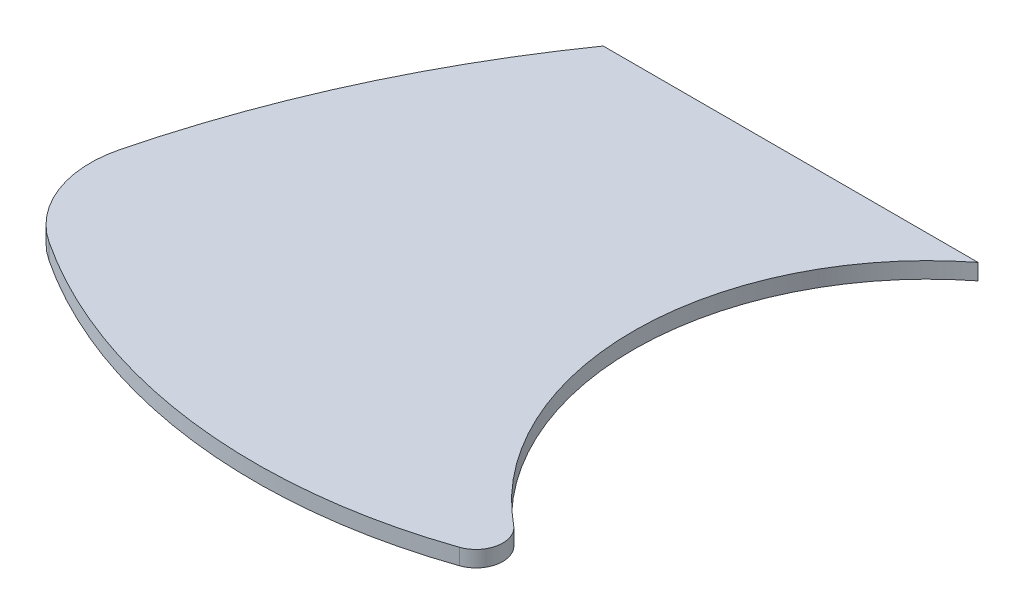
ISO-10303-21;
HEADER;
FILE_DESCRIPTION(('STEP AP214'),'2;1');
FILE_NAME('part.step','',(''),(''),'','','');
FILE_SCHEMA(('AUTOMOTIVE_DESIGN { 1 0 10303 214 1 1 1 1 }'));
ENDSEC;
DATA;
#1=APPLICATION_CONTEXT('core data for automotive mechanical design processes');
#2=APPLICATION_PROTOCOL_DEFINITION('international standard','automotive_design',2000,#1);
#3=PRODUCT_CONTEXT('',#1,'mechanical');
#4=PRODUCT('Part','Part','',(#3));
#5=PRODUCT_RELATED_PRODUCT_CATEGORY('part','',(#4));
#6=PRODUCT_DEFINITION_FORMATION('','',#4);
#7=PRODUCT_DEFINITION_CONTEXT('part definition',#1,'design');
#8=PRODUCT_DEFINITION('design','',#6,#7);
#9=PRODUCT_DEFINITION_SHAPE('','',#8);
#10=(LENGTH_UNIT() NAMED_UNIT(*) SI_UNIT(.MILLI.,.METRE.));
#11=(NAMED_UNIT(*) PLANE_ANGLE_UNIT() SI_UNIT($,.RADIAN.));
#12=(NAMED_UNIT(*) SI_UNIT($,.STERADIAN.) SOLID_ANGLE_UNIT());
#13=UNCERTAINTY_MEASURE_WITH_UNIT(LENGTH_MEASURE(1.E-05),#10,'distance_accuracy_value','');
#14=(GEOMETRIC_REPRESENTATION_CONTEXT(3) GLOBAL_UNCERTAINTY_ASSIGNED_CONTEXT((#13)) GLOBAL_UNIT_ASSIGNED_CONTEXT((#10,
#11,#12)) REPRESENTATION_CONTEXT('',''));
#15=CARTESIAN_POINT('',(0.,0.,0.));
#16=DIRECTION('',(0.,0.,1.));
#17=DIRECTION('',(1.,0.,0.));
#18=AXIS2_PLACEMENT_3D('',#15,#16,#17);
#19=CARTESIAN_POINT('',(33.9302660176223,3.,43.2866844188069));
#20=DIRECTION('',(0.,-1.,0.));
#21=DIRECTION('',(0.,0.,-1.));
#22=AXIS2_PLACEMENT_3D('',#19,#20,#21);
#23=CYLINDRICAL_SURFACE('',#22,55.);
#24=CARTESIAN_POINT('',(33.9302660176223,0.,43.2866844188069));
#25=DIRECTION('',(0.,-1.,0.));
#26=DIRECTION('',(0.,0.,1.));
#27=AXIS2_PLACEMENT_3D('',#24,#25,#26);
#28=CIRCLE('',#27,55.);
#29=CARTESIAN_POINT('',(-0.820695536764456,0.,85.9173150855649));
#30=VERTEX_POINT('',#29);
#31=CARTESIAN_POINT('',(0.,0.,0.));
#32=VERTEX_POINT('',#31);
#33=EDGE_CURVE('E123',#30,#32,#28,.T.);
#34=ORIENTED_EDGE('',*,*,#33,.T.);
#35=DIRECTION('',(0.,-1.,0.));
#36=VECTOR('',#35,1.);
#37=CARTESIAN_POINT('',(0.,3.,0.));
#38=LINE('',#37,#36);
#39=CARTESIAN_POINT('',(0.,3.,0.));
#40=VERTEX_POINT('',#39);
#41=EDGE_CURVE('E11',#40,#32,#38,.T.);
#42=ORIENTED_EDGE('',*,*,#41,.F.);
#43=CARTESIAN_POINT('',(33.9302660176223,3.,43.2866844188069));
#44=DIRECTION('',(0.,-1.,0.));
#45=DIRECTION('',(0.,0.,1.));
#46=AXIS2_PLACEMENT_3D('',#43,#44,#45);
#47=CIRCLE('',#46,55.);
#48=CARTESIAN_POINT('',(-0.820695536764456,3.,85.9173150855649));
#49=VERTEX_POINT('',#48);
#50=EDGE_CURVE('E133',#49,#40,#47,.T.);
#51=ORIENTED_EDGE('',*,*,#50,.F.);
#52=DIRECTION('',(0.,-1.,0.));
#53=VECTOR('',#52,1.);
#54=CARTESIAN_POINT('',(-0.820695536764456,3.,85.9173150855649));
#55=LINE('',#54,#53);
#56=EDGE_CURVE('E119',#49,#30,#55,.T.);
#57=ORIENTED_EDGE('',*,*,#56,.T.);
#58=EDGE_LOOP('',(#34,#42,#51,#57));
#59=FACE_BOUND('',#58,.T.);
#60=ADVANCED_FACE('F39',(#59),#23,.F.);
#61=CARTESIAN_POINT('',(0.,3.,0.));
#62=DIRECTION('',(0.,0.,1.));
#63=DIRECTION('',(1.,0.,0.));
#64=AXIS2_PLACEMENT_3D('',#61,#62,#63);
#65=PLANE('',#64);
#66=DIRECTION('',(-1.,0.,0.));
#67=VECTOR('',#66,1.);
#68=CARTESIAN_POINT('',(0.,0.,0.));
#69=LINE('',#68,#67);
#70=CARTESIAN_POINT('',(-70.,0.,0.));
#71=VERTEX_POINT('',#70);
#72=EDGE_CURVE('E126',#32,#71,#69,.T.);
#73=ORIENTED_EDGE('',*,*,#72,.T.);
#74=DIRECTION('',(0.,-1.,0.));
#75=VECTOR('',#74,1.);
#76=CARTESIAN_POINT('',(-70.,3.,0.));
#77=LINE('',#76,#75);
#78=CARTESIAN_POINT('',(-70.,3.,0.));
#79=VERTEX_POINT('',#78);
#80=EDGE_CURVE('E47',#79,#71,#77,.T.);
#81=ORIENTED_EDGE('',*,*,#80,.F.);
#82=DIRECTION('',(-1.,0.,0.));
#83=VECTOR('',#82,1.);
#84=CARTESIAN_POINT('',(0.,3.,0.));
#85=LINE('',#84,#83);
#86=EDGE_CURVE('E92',#40,#79,#85,.T.);
#87=ORIENTED_EDGE('',*,*,#86,.F.);
#88=ORIENTED_EDGE('',*,*,#41,.T.);
#89=EDGE_LOOP('',(#73,#81,#87,#88));
#90=FACE_BOUND('',#89,.T.);
#91=ADVANCED_FACE('F157',(#90),#65,.F.);
#92=CARTESIAN_POINT('',(84.1791212349216,3.,108.175879746189));
#93=DIRECTION('',(0.,-1.,0.));
#94=DIRECTION('',(0.,0.,-1.));
#95=AXIS2_PLACEMENT_3D('',#92,#93,#94);
#96=CYLINDRICAL_SURFACE('',#95,188.343362993323);
#97=CARTESIAN_POINT('',(84.1791212349216,0.,108.175879746189));
#98=DIRECTION('',(0.,1.,0.));
#99=DIRECTION('',(0.,0.,1.));
#100=AXIS2_PLACEMENT_3D('',#97,#98,#99);
#101=CIRCLE('',#100,188.343362993323);
#102=CARTESIAN_POINT('',(-98.3899552973508,0.,61.8967842733099));
#103=VERTEX_POINT('',#102);
#104=EDGE_CURVE('E128',#71,#103,#101,.T.);
#105=ORIENTED_EDGE('',*,*,#104,.T.);
#106=DIRECTION('',(0.,-1.,0.));
#107=VECTOR('',#106,1.);
#108=CARTESIAN_POINT('',(-98.3899552973508,3.,61.8967842733099));
#109=LINE('',#108,#107);
#110=CARTESIAN_POINT('',(-98.3899552973508,3.,61.8967842733099));
#111=VERTEX_POINT('',#110);
#112=EDGE_CURVE('E114',#111,#103,#109,.T.);
#113=ORIENTED_EDGE('',*,*,#112,.F.);
#114=CARTESIAN_POINT('',(84.1791212349216,3.,108.175879746189));
#115=DIRECTION('',(0.,1.,0.));
#116=DIRECTION('',(0.,0.,1.));
#117=AXIS2_PLACEMENT_3D('',#114,#115,#116);
#118=CIRCLE('',#117,188.343362993323);
#119=EDGE_CURVE('E105',#79,#111,#118,.T.);
#120=ORIENTED_EDGE('',*,*,#119,.F.);
#121=ORIENTED_EDGE('',*,*,#80,.T.);
#122=EDGE_LOOP('',(#105,#113,#120,#121));
#123=FACE_BOUND('',#122,.T.);
#124=ADVANCED_FACE('F139',(#123),#96,.T.);
#125=CARTESIAN_POINT('',(-79.003121205539,3.,66.8111167708687));
#126=DIRECTION('',(0.,-1.,0.));
#127=DIRECTION('',(0.,0.,-1.));
#128=AXIS2_PLACEMENT_3D('',#125,#126,#127);
#129=CYLINDRICAL_SURFACE('',#128,20.);
#130=CARTESIAN_POINT('',(-79.003121205539,0.,66.8111167708687));
#131=DIRECTION('',(0.,1.,0.));
#132=DIRECTION('',(0.,0.,1.));
#133=AXIS2_PLACEMENT_3D('',#130,#131,#132);
#134=CIRCLE('',#133,20.);
#135=CARTESIAN_POINT('',(-90.0039015069237,0.,83.5138959635858));
#136=VERTEX_POINT('',#135);
#137=EDGE_CURVE('E113',#103,#136,#134,.T.);
#138=ORIENTED_EDGE('',*,*,#137,.T.);
#139=DIRECTION('',(0.,-1.,0.));
#140=VECTOR('',#139,1.);
#141=CARTESIAN_POINT('',(-90.0039015069237,3.,83.5138959635858));
#142=LINE('',#141,#140);
#143=CARTESIAN_POINT('',(-90.0039015069237,3.,83.5138959635858));
#144=VERTEX_POINT('',#143);
#145=EDGE_CURVE('E110',#144,#136,#142,.T.);
#146=ORIENTED_EDGE('',*,*,#145,.F.);
#147=CARTESIAN_POINT('',(-79.003121205539,3.,66.8111167708687));
#148=DIRECTION('',(0.,1.,0.));
#149=DIRECTION('',(0.,0.,1.));
#150=AXIS2_PLACEMENT_3D('',#147,#148,#149);
#151=CIRCLE('',#150,20.);
#152=EDGE_CURVE('E99',#111,#144,#151,.T.);
#153=ORIENTED_EDGE('',*,*,#152,.F.);
#154=ORIENTED_EDGE('',*,*,#112,.T.);
#155=EDGE_LOOP('',(#138,#146,#153,#154));
#156=FACE_BOUND('',#155,.T.);
#157=ADVANCED_FACE('F111',(#156),#129,.T.);
#158=CARTESIAN_POINT('',(-35.,3.,0.));
#159=DIRECTION('',(0.,-1.,0.));
#160=DIRECTION('',(0.,0.,-1.));
#161=AXIS2_PLACEMENT_3D('',#158,#159,#160);
#162=CYLINDRICAL_SURFACE('',#161,100.);
#163=CARTESIAN_POINT('',(-35.,0.,0.));
#164=DIRECTION('',(0.,1.,0.));
#165=DIRECTION('',(0.,0.,1.));
#166=AXIS2_PLACEMENT_3D('',#163,#164,#165);
#167=CIRCLE('',#166,100.);
#168=CARTESIAN_POINT('',(-2.34723564199005,0.,94.5187652256433));
#169=VERTEX_POINT('',#168);
#170=EDGE_CURVE('E78',#136,#169,#167,.T.);
#171=ORIENTED_EDGE('',*,*,#170,.T.);
#172=DIRECTION('',(0.,-1.,0.));
#173=VECTOR('',#172,1.);
#174=CARTESIAN_POINT('',(-2.34723564199005,3.,94.5187652256433));
#175=LINE('',#174,#173);
#176=CARTESIAN_POINT('',(-2.34723564199005,3.,94.5187652256433));
#177=VERTEX_POINT('',#176);
#178=EDGE_CURVE('E115',#177,#169,#175,.T.);
#179=ORIENTED_EDGE('',*,*,#178,.F.);
#180=CARTESIAN_POINT('',(-35.,3.,0.));
#181=DIRECTION('',(0.,1.,0.));
#182=DIRECTION('',(0.,0.,1.));
#183=AXIS2_PLACEMENT_3D('',#180,#181,#182);
#184=CIRCLE('',#183,100.);
#185=EDGE_CURVE('E103',#144,#177,#184,.T.);
#186=ORIENTED_EDGE('',*,*,#185,.F.);
#187=ORIENTED_EDGE('',*,*,#145,.T.);
#188=EDGE_LOOP('',(#171,#179,#186,#187));
#189=FACE_BOUND('',#188,.T.);
#190=ADVANCED_FACE('F117',(#189),#162,.T.);
#191=CARTESIAN_POINT('',(-3.97987385989053,3.,89.7928269643611));
#192=DIRECTION('',(0.,-1.,0.));
#193=DIRECTION('',(0.,0.,-1.));
#194=AXIS2_PLACEMENT_3D('',#191,#192,#193);
#195=CYLINDRICAL_SURFACE('',#194,5.);
#196=CARTESIAN_POINT('',(-3.97987385989053,0.,89.7928269643611));
#197=DIRECTION('',(0.,1.,0.));
#198=DIRECTION('',(0.,0.,-1.));
#199=AXIS2_PLACEMENT_3D('',#196,#197,#198);
#200=CIRCLE('',#199,5.);
#201=EDGE_CURVE('E84',#169,#30,#200,.T.);
#202=ORIENTED_EDGE('',*,*,#201,.T.);
#203=ORIENTED_EDGE('',*,*,#56,.F.);
#204=CARTESIAN_POINT('',(-3.97987385989053,3.,89.7928269643611));
#205=DIRECTION('',(0.,1.,0.));
#206=DIRECTION('',(0.,0.,-1.));
#207=AXIS2_PLACEMENT_3D('',#204,#205,#206);
#208=CIRCLE('',#207,5.);
#209=EDGE_CURVE('E55',#177,#49,#208,.T.);
#210=ORIENTED_EDGE('',*,*,#209,.F.);
#211=ORIENTED_EDGE('',*,*,#178,.T.);
#212=EDGE_LOOP('',(#202,#203,#210,#211));
#213=FACE_BOUND('',#212,.T.);
#214=ADVANCED_FACE('F146',(#213),#195,.T.);
#215=CARTESIAN_POINT('',(33.9302660176223,3.,43.2866844188069));
#216=DIRECTION('',(0.,1.,0.));
#217=DIRECTION('',(0.,0.,1.));
#218=AXIS2_PLACEMENT_3D('',#215,#216,#217);
#219=PLANE('',#218);
#220=ORIENTED_EDGE('',*,*,#50,.T.);
#221=ORIENTED_EDGE('',*,*,#86,.T.);
#222=ORIENTED_EDGE('',*,*,#119,.T.);
#223=ORIENTED_EDGE('',*,*,#152,.T.);
#224=ORIENTED_EDGE('',*,*,#185,.T.);
#225=ORIENTED_EDGE('',*,*,#209,.T.);
#226=EDGE_LOOP('',(#220,#221,#222,#223,#224,#225));
#227=FACE_BOUND('',#226,.T.);
#228=ADVANCED_FACE('F101',(#227),#219,.T.);
#229=CARTESIAN_POINT('',(33.9302660176223,0.,43.2866844188069));
#230=DIRECTION('',(0.,1.,0.));
#231=DIRECTION('',(0.,0.,1.));
#232=AXIS2_PLACEMENT_3D('',#229,#230,#231);
#233=PLANE('',#232);
#234=ORIENTED_EDGE('',*,*,#33,.F.);
#235=ORIENTED_EDGE('',*,*,#201,.F.);
#236=ORIENTED_EDGE('',*,*,#170,.F.);
#237=ORIENTED_EDGE('',*,*,#137,.F.);
#238=ORIENTED_EDGE('',*,*,#104,.F.);
#239=ORIENTED_EDGE('',*,*,#72,.F.);
#240=EDGE_LOOP('',(#234,#235,#236,#237,#238,#239));
#241=FACE_BOUND('',#240,.T.);
#242=ADVANCED_FACE('F142',(#241),#233,.F.);
#243=CLOSED_SHELL('',(#60,#91,#124,#157,#190,#214,#228,#242));
#244=MANIFOLD_SOLID_BREP('B2',#243);
#245=ADVANCED_BREP_SHAPE_REPRESENTATION('',(#18,#244),#14);
#246=SHAPE_DEFINITION_REPRESENTATION(#9,#245);
ENDSEC;
END-ISO-10303-21;
